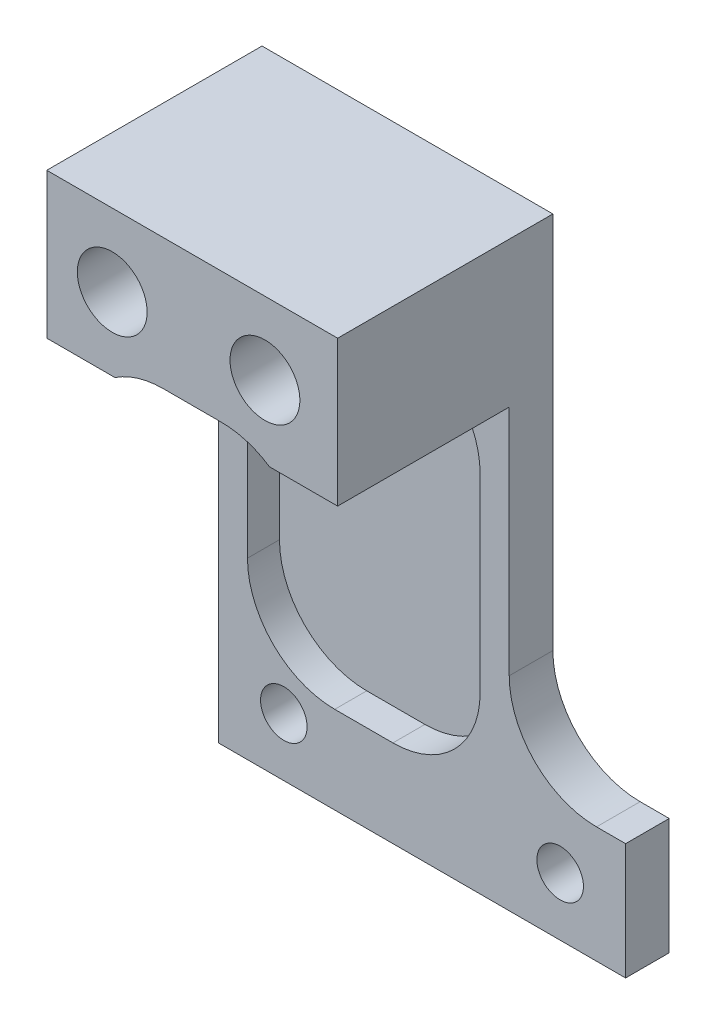
ISO-10303-21;
HEADER;
FILE_DESCRIPTION(('STEP AP214'),'2;1');
FILE_NAME('part.step','',(''),(''),'','','');
FILE_SCHEMA(('AUTOMOTIVE_DESIGN { 1 0 10303 214 1 1 1 1 }'));
ENDSEC;
DATA;
#1=APPLICATION_CONTEXT('core data for automotive mechanical design processes');
#2=APPLICATION_PROTOCOL_DEFINITION('international standard','automotive_design',2000,#1);
#3=PRODUCT_CONTEXT('',#1,'mechanical');
#4=PRODUCT('Part','Part','',(#3));
#5=PRODUCT_RELATED_PRODUCT_CATEGORY('part','',(#4));
#6=PRODUCT_DEFINITION_FORMATION('','',#4);
#7=PRODUCT_DEFINITION_CONTEXT('part definition',#1,'design');
#8=PRODUCT_DEFINITION('design','',#6,#7);
#9=PRODUCT_DEFINITION_SHAPE('','',#8);
#10=(LENGTH_UNIT() NAMED_UNIT(*) SI_UNIT(.MILLI.,.METRE.));
#11=(NAMED_UNIT(*) PLANE_ANGLE_UNIT() SI_UNIT($,.RADIAN.));
#12=(NAMED_UNIT(*) SI_UNIT($,.STERADIAN.) SOLID_ANGLE_UNIT());
#13=UNCERTAINTY_MEASURE_WITH_UNIT(LENGTH_MEASURE(1.E-05),#10,'distance_accuracy_value','');
#14=(GEOMETRIC_REPRESENTATION_CONTEXT(3) GLOBAL_UNCERTAINTY_ASSIGNED_CONTEXT((#13)) GLOBAL_UNIT_ASSIGNED_CONTEXT((#10,
#11,#12)) REPRESENTATION_CONTEXT('',''));
#15=CARTESIAN_POINT('',(0.,0.,0.));
#16=DIRECTION('',(0.,0.,1.));
#17=DIRECTION('',(1.,0.,0.));
#18=AXIS2_PLACEMENT_3D('',#15,#16,#17);
#19=CARTESIAN_POINT('',(7.,5.00000000000002,7.4));
#20=DIRECTION('',(0.,1.,0.));
#21=DIRECTION('',(-1.,0.,0.));
#22=AXIS2_PLACEMENT_3D('',#19,#20,#21);
#23=PLANE('',#22);
#24=DIRECTION('',(1.,0.,0.));
#25=VECTOR('',#24,1.);
#26=CARTESIAN_POINT('',(7.,5.00000000000002,1.5));
#27=LINE('',#26,#25);
#28=CARTESIAN_POINT('',(-7.,5.00000000000002,1.5));
#29=VERTEX_POINT('',#28);
#30=CARTESIAN_POINT('',(-4.6583123951777,5.00000000000002,1.5));
#31=VERTEX_POINT('',#30);
#32=EDGE_CURVE('E305',#29,#31,#27,.T.);
#33=ORIENTED_EDGE('',*,*,#32,.T.);
#34=DIRECTION('',(0.,0.,1.));
#35=VECTOR('',#34,1.);
#36=CARTESIAN_POINT('',(-4.6583123951777,5.00000000000002,0.4));
#37=LINE('',#36,#35);
#38=CARTESIAN_POINT('',(-4.6583123951777,5.00000000000002,7.4));
#39=VERTEX_POINT('',#38);
#40=EDGE_CURVE('E235',#31,#39,#37,.T.);
#41=ORIENTED_EDGE('',*,*,#40,.T.);
#42=DIRECTION('',(1.,0.,0.));
#43=VECTOR('',#42,1.);
#44=CARTESIAN_POINT('',(7.,5.00000000000002,7.4));
#45=LINE('',#44,#43);
#46=CARTESIAN_POINT('',(-7.,5.00000000000002,7.4));
#47=VERTEX_POINT('',#46);
#48=EDGE_CURVE('E308',#47,#39,#45,.T.);
#49=ORIENTED_EDGE('',*,*,#48,.F.);
#50=DIRECTION('',(0.,0.,-1.));
#51=VECTOR('',#50,1.);
#52=CARTESIAN_POINT('',(-7.,5.00000000000002,7.4));
#53=LINE('',#52,#51);
#54=EDGE_CURVE('E311',#47,#29,#53,.T.);
#55=ORIENTED_EDGE('',*,*,#54,.T.);
#56=EDGE_LOOP('',(#33,#41,#49,#55));
#57=FACE_BOUND('',#56,.T.);
#58=ADVANCED_FACE('F38',(#57),#23,.F.);
#59=CARTESIAN_POINT('',(-7.,0.,1.5));
#60=DIRECTION('',(-1.,0.,0.));
#61=DIRECTION('',(0.,-1.,0.));
#62=AXIS2_PLACEMENT_3D('',#59,#60,#61);
#63=PLANE('',#62);
#64=DIRECTION('',(0.,1.,0.));
#65=VECTOR('',#64,1.);
#66=CARTESIAN_POINT('',(-7.,0.,0.));
#67=LINE('',#66,#65);
#68=CARTESIAN_POINT('',(-7.,-9.99999999999999,0.));
#69=VERTEX_POINT('',#68);
#70=CARTESIAN_POINT('',(-7.,10.,0.));
#71=VERTEX_POINT('',#70);
#72=EDGE_CURVE('E316',#69,#71,#67,.T.);
#73=ORIENTED_EDGE('',*,*,#72,.F.);
#74=DIRECTION('',(0.,0.,-1.));
#75=VECTOR('',#74,1.);
#76=CARTESIAN_POINT('',(-7.,-9.99999999999999,1.5));
#77=LINE('',#76,#75);
#78=CARTESIAN_POINT('',(-7.,-9.99999999999999,1.5));
#79=VERTEX_POINT('',#78);
#80=EDGE_CURVE('E341',#79,#69,#77,.T.);
#81=ORIENTED_EDGE('',*,*,#80,.F.);
#82=DIRECTION('',(0.,1.,0.));
#83=VECTOR('',#82,1.);
#84=CARTESIAN_POINT('',(-7.,0.,1.5));
#85=LINE('',#84,#83);
#86=EDGE_CURVE('E317',#79,#29,#85,.T.);
#87=ORIENTED_EDGE('',*,*,#86,.T.);
#88=ORIENTED_EDGE('',*,*,#54,.F.);
#89=DIRECTION('',(0.,-1.,0.));
#90=VECTOR('',#89,1.);
#91=CARTESIAN_POINT('',(-7.,10.,7.4));
#92=LINE('',#91,#90);
#93=CARTESIAN_POINT('',(-7.,10.,7.4));
#94=VERTEX_POINT('',#93);
#95=EDGE_CURVE('E304',#94,#47,#92,.T.);
#96=ORIENTED_EDGE('',*,*,#95,.F.);
#97=DIRECTION('',(0.,0.,-1.));
#98=VECTOR('',#97,1.);
#99=CARTESIAN_POINT('',(-7.,10.,1.5));
#100=LINE('',#99,#98);
#101=EDGE_CURVE('E327',#94,#71,#100,.T.);
#102=ORIENTED_EDGE('',*,*,#101,.T.);
#103=EDGE_LOOP('',(#73,#81,#87,#88,#96,#102));
#104=FACE_BOUND('',#103,.T.);
#105=ADVANCED_FACE('F40',(#104),#63,.T.);
#106=CARTESIAN_POINT('',(0.,-9.99999999999999,1.5));
#107=DIRECTION('',(0.,-1.,0.));
#108=DIRECTION('',(1.,0.,0.));
#109=AXIS2_PLACEMENT_3D('',#106,#107,#108);
#110=PLANE('',#109);
#111=DIRECTION('',(-1.,0.,0.));
#112=VECTOR('',#111,1.);
#113=CARTESIAN_POINT('',(0.,-9.99999999999999,0.));
#114=LINE('',#113,#112);
#115=CARTESIAN_POINT('',(7.00000000000001,-9.99999999999998,0.));
#116=VERTEX_POINT('',#115);
#117=EDGE_CURVE('E330',#116,#69,#114,.T.);
#118=ORIENTED_EDGE('',*,*,#117,.F.);
#119=DIRECTION('',(0.,0.,-1.));
#120=VECTOR('',#119,1.);
#121=CARTESIAN_POINT('',(7.00000000000001,-9.99999999999998,1.5));
#122=LINE('',#121,#120);
#123=CARTESIAN_POINT('',(7.00000000000001,-9.99999999999998,1.5));
#124=VERTEX_POINT('',#123);
#125=EDGE_CURVE('E339',#124,#116,#122,.T.);
#126=ORIENTED_EDGE('',*,*,#125,.F.);
#127=DIRECTION('',(-1.,0.,0.));
#128=VECTOR('',#127,1.);
#129=CARTESIAN_POINT('',(0.,-9.99999999999999,1.5));
#130=LINE('',#129,#128);
#131=EDGE_CURVE('E320',#124,#79,#130,.T.);
#132=ORIENTED_EDGE('',*,*,#131,.T.);
#133=ORIENTED_EDGE('',*,*,#80,.T.);
#134=EDGE_LOOP('',(#118,#126,#132,#133));
#135=FACE_BOUND('',#134,.T.);
#136=ADVANCED_FACE('F422',(#135),#110,.T.);
#137=CARTESIAN_POINT('',(7.,0.,1.5));
#138=DIRECTION('',(-1.,0.,0.));
#139=DIRECTION('',(0.,-1.,0.));
#140=AXIS2_PLACEMENT_3D('',#137,#138,#139);
#141=PLANE('',#140);
#142=DIRECTION('',(0.,1.,0.));
#143=VECTOR('',#142,1.);
#144=CARTESIAN_POINT('',(7.,0.,0.));
#145=LINE('',#144,#143);
#146=CARTESIAN_POINT('',(7.,-5.99999999999998,0.));
#147=VERTEX_POINT('',#146);
#148=EDGE_CURVE('E333',#116,#147,#145,.T.);
#149=ORIENTED_EDGE('',*,*,#148,.T.);
#150=DIRECTION('',(0.,0.,1.));
#151=VECTOR('',#150,1.);
#152=CARTESIAN_POINT('',(7.,-5.99999999999998,0.));
#153=LINE('',#152,#151);
#154=CARTESIAN_POINT('',(7.,-5.99999999999998,1.5));
#155=VERTEX_POINT('',#154);
#156=EDGE_CURVE('E270',#147,#155,#153,.T.);
#157=ORIENTED_EDGE('',*,*,#156,.T.);
#158=DIRECTION('',(0.,1.,0.));
#159=VECTOR('',#158,1.);
#160=CARTESIAN_POINT('',(7.,0.,1.5));
#161=LINE('',#160,#159);
#162=EDGE_CURVE('E324',#124,#155,#161,.T.);
#163=ORIENTED_EDGE('',*,*,#162,.F.);
#164=ORIENTED_EDGE('',*,*,#125,.T.);
#165=EDGE_LOOP('',(#149,#157,#163,#164));
#166=FACE_BOUND('',#165,.T.);
#167=ADVANCED_FACE('F442',(#166),#141,.F.);
#168=CARTESIAN_POINT('',(0.,10.,1.5));
#169=DIRECTION('',(0.,-1.,0.));
#170=DIRECTION('',(1.,0.,0.));
#171=AXIS2_PLACEMENT_3D('',#168,#169,#170);
#172=PLANE('',#171);
#173=DIRECTION('',(-1.,0.,0.));
#174=VECTOR('',#173,1.);
#175=CARTESIAN_POINT('',(7.,10.,7.4));
#176=LINE('',#175,#174);
#177=CARTESIAN_POINT('',(3.,10.,7.4));
#178=VERTEX_POINT('',#177);
#179=EDGE_CURVE('E302',#178,#94,#176,.T.);
#180=ORIENTED_EDGE('',*,*,#179,.F.);
#181=DIRECTION('',(0.,0.,1.));
#182=VECTOR('',#181,1.);
#183=CARTESIAN_POINT('',(3.,10.,0.));
#184=LINE('',#183,#182);
#185=CARTESIAN_POINT('',(3.,10.,0.));
#186=VERTEX_POINT('',#185);
#187=EDGE_CURVE('E61',#186,#178,#184,.T.);
#188=ORIENTED_EDGE('',*,*,#187,.F.);
#189=DIRECTION('',(-1.,0.,0.));
#190=VECTOR('',#189,1.);
#191=CARTESIAN_POINT('',(0.,10.,0.));
#192=LINE('',#191,#190);
#193=EDGE_CURVE('E321',#186,#71,#192,.T.);
#194=ORIENTED_EDGE('',*,*,#193,.T.);
#195=ORIENTED_EDGE('',*,*,#101,.F.);
#196=EDGE_LOOP('',(#180,#188,#194,#195));
#197=FACE_BOUND('',#196,.T.);
#198=ADVANCED_FACE('F393',(#197),#172,.F.);
#199=CARTESIAN_POINT('',(0.,0.,1.5));
#200=DIRECTION('',(0.,0.,1.));
#201=DIRECTION('',(1.,0.,0.));
#202=AXIS2_PLACEMENT_3D('',#199,#200,#201);
#203=PLANE('',#202);
#204=CARTESIAN_POINT('',(-3.,2.50000000000002,1.5));
#205=DIRECTION('',(0.,0.,1.));
#206=DIRECTION('',(1.,0.,0.));
#207=AXIS2_PLACEMENT_3D('',#204,#205,#206);
#208=CIRCLE('',#207,3.);
#209=CARTESIAN_POINT('',(-6.,2.49999999999999,1.5));
#210=VERTEX_POINT('',#209);
#211=EDGE_CURVE('E176',#31,#210,#208,.T.);
#212=ORIENTED_EDGE('',*,*,#211,.F.);
#213=ORIENTED_EDGE('',*,*,#32,.F.);
#214=ORIENTED_EDGE('',*,*,#86,.F.);
#215=ORIENTED_EDGE('',*,*,#131,.F.);
#216=ORIENTED_EDGE('',*,*,#162,.T.);
#217=DIRECTION('',(1.,0.,0.));
#218=VECTOR('',#217,1.);
#219=CARTESIAN_POINT('',(0.,-5.99999999999998,1.5));
#220=LINE('',#219,#218);
#221=CARTESIAN_POINT('',(6.00000000000002,-5.99999999999998,1.5));
#222=VERTEX_POINT('',#221);
#223=EDGE_CURVE('E287',#222,#155,#220,.T.);
#224=ORIENTED_EDGE('',*,*,#223,.F.);
#225=CARTESIAN_POINT('',(6.,-2.99999999999998,1.5));
#226=DIRECTION('',(0.,0.,1.));
#227=DIRECTION('',(1.,0.,0.));
#228=AXIS2_PLACEMENT_3D('',#225,#226,#227);
#229=CIRCLE('',#228,3.);
#230=CARTESIAN_POINT('',(3.,-2.99999999999998,1.5));
#231=VERTEX_POINT('',#230);
#232=EDGE_CURVE('E285',#231,#222,#229,.T.);
#233=ORIENTED_EDGE('',*,*,#232,.F.);
#234=DIRECTION('',(0.,-1.,0.));
#235=VECTOR('',#234,1.);
#236=CARTESIAN_POINT('',(3.,0.,1.5));
#237=LINE('',#236,#235);
#238=CARTESIAN_POINT('',(3.,5.00000000000002,1.5));
#239=VERTEX_POINT('',#238);
#240=EDGE_CURVE('E283',#239,#231,#237,.T.);
#241=ORIENTED_EDGE('',*,*,#240,.F.);
#242=CARTESIAN_POINT('',(0.658312395177696,5.00000000000002,1.5));
#243=VERTEX_POINT('',#242);
#244=EDGE_CURVE('E301',#243,#239,#27,.T.);
#245=ORIENTED_EDGE('',*,*,#244,.F.);
#246=CARTESIAN_POINT('',(-1.,2.50000000000002,1.5));
#247=DIRECTION('',(0.,0.,1.));
#248=DIRECTION('',(1.,0.,0.));
#249=AXIS2_PLACEMENT_3D('',#246,#247,#248);
#250=CIRCLE('',#249,3.);
#251=CARTESIAN_POINT('',(2.,2.49999999999999,1.5));
#252=VERTEX_POINT('',#251);
#253=EDGE_CURVE('E233',#252,#243,#250,.T.);
#254=ORIENTED_EDGE('',*,*,#253,.F.);
#255=DIRECTION('',(0.,1.,0.));
#256=VECTOR('',#255,1.);
#257=CARTESIAN_POINT('',(2.,0.,1.5));
#258=LINE('',#257,#256);
#259=CARTESIAN_POINT('',(2.,-3.99999999999996,1.5));
#260=VERTEX_POINT('',#259);
#261=EDGE_CURVE('E11',#260,#252,#258,.T.);
#262=ORIENTED_EDGE('',*,*,#261,.F.);
#263=CARTESIAN_POINT('',(-1.,-3.99999999999998,1.5));
#264=DIRECTION('',(0.,0.,1.));
#265=DIRECTION('',(1.,0.,0.));
#266=AXIS2_PLACEMENT_3D('',#263,#264,#265);
#267=CIRCLE('',#266,3.);
#268=CARTESIAN_POINT('',(-1.00000000000002,-6.99999999999998,1.5));
#269=VERTEX_POINT('',#268);
#270=EDGE_CURVE('E46',#269,#260,#267,.T.);
#271=ORIENTED_EDGE('',*,*,#270,.F.);
#272=DIRECTION('',(1.,0.,0.));
#273=VECTOR('',#272,1.);
#274=CARTESIAN_POINT('',(0.,-6.99999999999998,1.5));
#275=LINE('',#274,#273);
#276=CARTESIAN_POINT('',(-2.99999999999998,-6.99999999999998,1.5));
#277=VERTEX_POINT('',#276);
#278=EDGE_CURVE('E353',#277,#269,#275,.T.);
#279=ORIENTED_EDGE('',*,*,#278,.F.);
#280=CARTESIAN_POINT('',(-3.,-3.99999999999998,1.5));
#281=DIRECTION('',(0.,0.,1.));
#282=DIRECTION('',(1.,0.,0.));
#283=AXIS2_PLACEMENT_3D('',#280,#281,#282);
#284=CIRCLE('',#283,3.);
#285=CARTESIAN_POINT('',(-6.,-3.99999999999996,1.5));
#286=VERTEX_POINT('',#285);
#287=EDGE_CURVE('E351',#286,#277,#284,.T.);
#288=ORIENTED_EDGE('',*,*,#287,.F.);
#289=DIRECTION('',(0.,-1.,0.));
#290=VECTOR('',#289,1.);
#291=CARTESIAN_POINT('',(-6.,0.,1.5));
#292=LINE('',#291,#290);
#293=EDGE_CURVE('E349',#210,#286,#292,.T.);
#294=ORIENTED_EDGE('',*,*,#293,.F.);
#295=EDGE_LOOP('',(#212,#213,#214,#215,#216,#224,#233,#241,#245,#254,#262,#271,#279,#288,#294));
#296=FACE_BOUND('',#295,.T.);
#297=CARTESIAN_POINT('',(-4.75,-7.99999999999999,1.5));
#298=DIRECTION('',(0.,0.,1.));
#299=DIRECTION('',(1.,0.,0.));
#300=AXIS2_PLACEMENT_3D('',#297,#298,#299);
#301=CIRCLE('',#300,0.799999999999994);
#302=CARTESIAN_POINT('',(-3.95,-7.99999999999999,1.5));
#303=VERTEX_POINT('',#302);
#304=EDGE_CURVE('E292',#303,#303,#301,.T.);
#305=ORIENTED_EDGE('',*,*,#304,.F.);
#306=EDGE_LOOP('',(#305));
#307=FACE_BOUND('',#306,.T.);
#308=CARTESIAN_POINT('',(4.75,-7.99999999999999,1.5));
#309=DIRECTION('',(0.,0.,1.));
#310=DIRECTION('',(1.,0.,0.));
#311=AXIS2_PLACEMENT_3D('',#308,#309,#310);
#312=CIRCLE('',#311,0.799999999999994);
#313=CARTESIAN_POINT('',(5.55,-7.99999999999999,1.5));
#314=VERTEX_POINT('',#313);
#315=EDGE_CURVE('E298',#314,#314,#312,.T.);
#316=ORIENTED_EDGE('',*,*,#315,.F.);
#317=EDGE_LOOP('',(#316));
#318=FACE_BOUND('',#317,.T.);
#319=ADVANCED_FACE('F365',(#296,#307,#318),#203,.T.);
#320=CARTESIAN_POINT('',(0.,0.,0.));
#321=DIRECTION('',(0.,0.,1.));
#322=DIRECTION('',(1.,0.,0.));
#323=AXIS2_PLACEMENT_3D('',#320,#321,#322);
#324=PLANE('',#323);
#325=CARTESIAN_POINT('',(-4.75,7.50000000000001,0.));
#326=DIRECTION('',(0.,0.,-1.));
#327=DIRECTION('',(-1.,0.,0.));
#328=AXIS2_PLACEMENT_3D('',#325,#326,#327);
#329=CIRCLE('',#328,2.2);
#330=CARTESIAN_POINT('',(-6.95,7.50000000000001,0.));
#331=VERTEX_POINT('',#330);
#332=EDGE_CURVE('E239',#331,#331,#329,.T.);
#333=ORIENTED_EDGE('',*,*,#332,.F.);
#334=EDGE_LOOP('',(#333));
#335=FACE_BOUND('',#334,.T.);
#336=CARTESIAN_POINT('',(0.499999999999997,7.50000000000001,0.));
#337=DIRECTION('',(0.,0.,-1.));
#338=DIRECTION('',(-1.,0.,0.));
#339=AXIS2_PLACEMENT_3D('',#336,#337,#338);
#340=CIRCLE('',#339,2.2);
#341=CARTESIAN_POINT('',(-1.7,7.50000000000001,0.));
#342=VERTEX_POINT('',#341);
#343=EDGE_CURVE('E249',#342,#342,#340,.T.);
#344=ORIENTED_EDGE('',*,*,#343,.F.);
#345=EDGE_LOOP('',(#344));
#346=FACE_BOUND('',#345,.T.);
#347=CARTESIAN_POINT('',(-4.75,-7.99999999999999,0.));
#348=DIRECTION('',(0.,0.,-1.));
#349=DIRECTION('',(-1.,0.,0.));
#350=AXIS2_PLACEMENT_3D('',#347,#348,#349);
#351=CIRCLE('',#350,0.79999999999999);
#352=CARTESIAN_POINT('',(-5.54999999999999,-7.99999999999999,0.));
#353=VERTEX_POINT('',#352);
#354=EDGE_CURVE('E289',#353,#353,#351,.T.);
#355=ORIENTED_EDGE('',*,*,#354,.F.);
#356=EDGE_LOOP('',(#355));
#357=FACE_BOUND('',#356,.T.);
#358=CARTESIAN_POINT('',(4.75,-7.99999999999999,0.));
#359=DIRECTION('',(0.,0.,-1.));
#360=DIRECTION('',(-1.,0.,0.));
#361=AXIS2_PLACEMENT_3D('',#358,#359,#360);
#362=CIRCLE('',#361,0.79999999999999);
#363=CARTESIAN_POINT('',(3.95000000000001,-7.99999999999999,0.));
#364=VERTEX_POINT('',#363);
#365=EDGE_CURVE('E295',#364,#364,#362,.T.);
#366=ORIENTED_EDGE('',*,*,#365,.F.);
#367=EDGE_LOOP('',(#366));
#368=FACE_BOUND('',#367,.T.);
#369=CARTESIAN_POINT('',(6.,-2.99999999999998,0.));
#370=DIRECTION('',(0.,0.,1.));
#371=DIRECTION('',(-1.,0.,0.));
#372=AXIS2_PLACEMENT_3D('',#369,#370,#371);
#373=CIRCLE('',#372,3.);
#374=CARTESIAN_POINT('',(3.,-2.99999999999998,0.));
#375=VERTEX_POINT('',#374);
#376=CARTESIAN_POINT('',(6.00000000000002,-5.99999999999998,0.));
#377=VERTEX_POINT('',#376);
#378=EDGE_CURVE('E262',#375,#377,#373,.T.);
#379=ORIENTED_EDGE('',*,*,#378,.T.);
#380=DIRECTION('',(1.,0.,0.));
#381=VECTOR('',#380,1.);
#382=CARTESIAN_POINT('',(7.,-5.99999999999998,0.));
#383=LINE('',#382,#381);
#384=EDGE_CURVE('E266',#377,#147,#383,.T.);
#385=ORIENTED_EDGE('',*,*,#384,.T.);
#386=ORIENTED_EDGE('',*,*,#148,.F.);
#387=ORIENTED_EDGE('',*,*,#117,.T.);
#388=ORIENTED_EDGE('',*,*,#72,.T.);
#389=ORIENTED_EDGE('',*,*,#193,.F.);
#390=DIRECTION('',(0.,-1.,0.));
#391=VECTOR('',#390,1.);
#392=CARTESIAN_POINT('',(3.,-2.99999999999996,0.));
#393=LINE('',#392,#391);
#394=EDGE_CURVE('E259',#186,#375,#393,.T.);
#395=ORIENTED_EDGE('',*,*,#394,.T.);
#396=EDGE_LOOP('',(#379,#385,#386,#387,#388,#389,#395));
#397=FACE_BOUND('',#396,.T.);
#398=ADVANCED_FACE('F390',(#335,#346,#357,#368,#397),#324,.F.);
#399=CARTESIAN_POINT('',(0.658312395177697,5.00000000000002,7.4));
#400=VERTEX_POINT('',#399);
#401=CARTESIAN_POINT('',(3.,5.00000000000002,7.4));
#402=VERTEX_POINT('',#401);
#403=EDGE_CURVE('E307',#400,#402,#45,.T.);
#404=ORIENTED_EDGE('',*,*,#403,.F.);
#405=DIRECTION('',(0.,0.,1.));
#406=VECTOR('',#405,1.);
#407=CARTESIAN_POINT('',(0.658312395177696,5.00000000000002,0.4));
#408=LINE('',#407,#406);
#409=EDGE_CURVE('E53',#400,#243,#408,.F.);
#410=ORIENTED_EDGE('',*,*,#409,.T.);
#411=ORIENTED_EDGE('',*,*,#244,.T.);
#412=DIRECTION('',(0.,0.,1.));
#413=VECTOR('',#412,1.);
#414=CARTESIAN_POINT('',(3.,5.00000000000002,7.4));
#415=LINE('',#414,#413);
#416=EDGE_CURVE('E273',#239,#402,#415,.T.);
#417=ORIENTED_EDGE('',*,*,#416,.T.);
#418=EDGE_LOOP('',(#404,#410,#411,#417));
#419=FACE_BOUND('',#418,.T.);
#420=ADVANCED_FACE('F373',(#419),#23,.F.);
#421=CARTESIAN_POINT('',(0.,0.,7.4));
#422=DIRECTION('',(0.,0.,-1.));
#423=DIRECTION('',(-1.,0.,0.));
#424=AXIS2_PLACEMENT_3D('',#421,#422,#423);
#425=PLANE('',#424);
#426=CARTESIAN_POINT('',(-4.75,7.50000000000001,7.4));
#427=DIRECTION('',(0.,0.,-1.));
#428=DIRECTION('',(-1.,0.,0.));
#429=AXIS2_PLACEMENT_3D('',#426,#427,#428);
#430=CIRCLE('',#429,1.2);
#431=CARTESIAN_POINT('',(-5.95,7.50000000000001,7.4));
#432=VERTEX_POINT('',#431);
#433=EDGE_CURVE('E248',#432,#432,#430,.T.);
#434=ORIENTED_EDGE('',*,*,#433,.T.);
#435=EDGE_LOOP('',(#434));
#436=FACE_BOUND('',#435,.T.);
#437=CARTESIAN_POINT('',(0.499999999999997,7.50000000000001,7.4));
#438=DIRECTION('',(0.,0.,-1.));
#439=DIRECTION('',(-1.,0.,0.));
#440=AXIS2_PLACEMENT_3D('',#437,#438,#439);
#441=CIRCLE('',#440,1.2);
#442=CARTESIAN_POINT('',(-0.700000000000001,7.50000000000001,7.4));
#443=VERTEX_POINT('',#442);
#444=EDGE_CURVE('E258',#443,#443,#441,.T.);
#445=ORIENTED_EDGE('',*,*,#444,.T.);
#446=EDGE_LOOP('',(#445));
#447=FACE_BOUND('',#446,.T.);
#448=ORIENTED_EDGE('',*,*,#48,.T.);
#449=CARTESIAN_POINT('',(-3.,2.50000000000002,7.4));
#450=DIRECTION('',(0.,0.,1.));
#451=DIRECTION('',(1.,0.,0.));
#452=AXIS2_PLACEMENT_3D('',#449,#450,#451);
#453=CIRCLE('',#452,3.);
#454=CARTESIAN_POINT('',(-2.99999999999998,5.50000000000002,7.4));
#455=VERTEX_POINT('',#454);
#456=EDGE_CURVE('E197',#455,#39,#453,.T.);
#457=ORIENTED_EDGE('',*,*,#456,.F.);
#458=DIRECTION('',(-1.,0.,0.));
#459=VECTOR('',#458,1.);
#460=CARTESIAN_POINT('',(-2.99999999999998,5.50000000000002,7.4));
#461=LINE('',#460,#459);
#462=CARTESIAN_POINT('',(-1.00000000000002,5.50000000000002,7.4));
#463=VERTEX_POINT('',#462);
#464=EDGE_CURVE('E194',#463,#455,#461,.T.);
#465=ORIENTED_EDGE('',*,*,#464,.F.);
#466=CARTESIAN_POINT('',(-1.,2.50000000000002,7.4));
#467=DIRECTION('',(0.,0.,-1.));
#468=DIRECTION('',(-1.,0.,0.));
#469=AXIS2_PLACEMENT_3D('',#466,#467,#468);
#470=CIRCLE('',#469,3.);
#471=EDGE_CURVE('E343',#463,#400,#470,.T.);
#472=ORIENTED_EDGE('',*,*,#471,.T.);
#473=ORIENTED_EDGE('',*,*,#403,.T.);
#474=DIRECTION('',(0.,-1.,0.));
#475=VECTOR('',#474,1.);
#476=CARTESIAN_POINT('',(3.,-2.99999999999996,7.4));
#477=LINE('',#476,#475);
#478=EDGE_CURVE('E263',#178,#402,#477,.T.);
#479=ORIENTED_EDGE('',*,*,#478,.F.);
#480=ORIENTED_EDGE('',*,*,#179,.T.);
#481=ORIENTED_EDGE('',*,*,#95,.T.);
#482=EDGE_LOOP('',(#448,#457,#465,#472,#473,#479,#480,#481));
#483=FACE_BOUND('',#482,.T.);
#484=ADVANCED_FACE('F376',(#436,#447,#483),#425,.F.);
#485=CARTESIAN_POINT('',(4.75,-7.99999999999999,0.));
#486=DIRECTION('',(0.,0.,-1.));
#487=DIRECTION('',(-1.,0.,0.));
#488=AXIS2_PLACEMENT_3D('',#485,#486,#487);
#489=CYLINDRICAL_SURFACE('',#488,0.799999999999994);
#490=ORIENTED_EDGE('',*,*,#315,.T.);
#491=EDGE_LOOP('',(#490));
#492=FACE_BOUND('',#491,.T.);
#493=ORIENTED_EDGE('',*,*,#365,.T.);
#494=EDGE_LOOP('',(#493));
#495=FACE_BOUND('',#494,.T.);
#496=ADVANCED_FACE('F430',(#492,#495),#489,.F.);
#497=CARTESIAN_POINT('',(-4.75,-7.99999999999999,0.));
#498=DIRECTION('',(0.,0.,-1.));
#499=DIRECTION('',(-1.,0.,0.));
#500=AXIS2_PLACEMENT_3D('',#497,#498,#499);
#501=CYLINDRICAL_SURFACE('',#500,0.799999999999994);
#502=ORIENTED_EDGE('',*,*,#304,.T.);
#503=EDGE_LOOP('',(#502));
#504=FACE_BOUND('',#503,.T.);
#505=ORIENTED_EDGE('',*,*,#354,.T.);
#506=EDGE_LOOP('',(#505));
#507=FACE_BOUND('',#506,.T.);
#508=ADVANCED_FACE('F582',(#504,#507),#501,.F.);
#509=CARTESIAN_POINT('',(7.,-5.99999999999998,0.));
#510=DIRECTION('',(0.,-1.,0.));
#511=DIRECTION('',(0.,0.,-1.));
#512=AXIS2_PLACEMENT_3D('',#509,#510,#511);
#513=PLANE('',#512);
#514=ORIENTED_EDGE('',*,*,#223,.T.);
#515=ORIENTED_EDGE('',*,*,#156,.F.);
#516=ORIENTED_EDGE('',*,*,#384,.F.);
#517=DIRECTION('',(0.,0.,1.));
#518=VECTOR('',#517,1.);
#519=CARTESIAN_POINT('',(6.00000000000002,-5.99999999999998,0.));
#520=LINE('',#519,#518);
#521=EDGE_CURVE('E274',#377,#222,#520,.T.);
#522=ORIENTED_EDGE('',*,*,#521,.T.);
#523=EDGE_LOOP('',(#514,#515,#516,#522));
#524=FACE_BOUND('',#523,.T.);
#525=ADVANCED_FACE('F387',(#524),#513,.F.);
#526=CARTESIAN_POINT('',(6.,-2.99999999999998,0.));
#527=DIRECTION('',(0.,0.,1.));
#528=DIRECTION('',(1.,0.,0.));
#529=AXIS2_PLACEMENT_3D('',#526,#527,#528);
#530=CYLINDRICAL_SURFACE('',#529,3.);
#531=ORIENTED_EDGE('',*,*,#232,.T.);
#532=ORIENTED_EDGE('',*,*,#521,.F.);
#533=ORIENTED_EDGE('',*,*,#378,.F.);
#534=DIRECTION('',(0.,0.,1.));
#535=VECTOR('',#534,1.);
#536=CARTESIAN_POINT('',(3.,-2.99999999999998,0.));
#537=LINE('',#536,#535);
#538=EDGE_CURVE('E277',#375,#231,#537,.T.);
#539=ORIENTED_EDGE('',*,*,#538,.T.);
#540=EDGE_LOOP('',(#531,#532,#533,#539));
#541=FACE_BOUND('',#540,.T.);
#542=ADVANCED_FACE('F383',(#541),#530,.F.);
#543=CARTESIAN_POINT('',(3.,-2.99999999999996,0.));
#544=DIRECTION('',(-1.,0.,0.));
#545=DIRECTION('',(0.,0.,1.));
#546=AXIS2_PLACEMENT_3D('',#543,#544,#545);
#547=PLANE('',#546);
#548=ORIENTED_EDGE('',*,*,#240,.T.);
#549=ORIENTED_EDGE('',*,*,#538,.F.);
#550=ORIENTED_EDGE('',*,*,#394,.F.);
#551=ORIENTED_EDGE('',*,*,#187,.T.);
#552=ORIENTED_EDGE('',*,*,#478,.T.);
#553=ORIENTED_EDGE('',*,*,#416,.F.);
#554=EDGE_LOOP('',(#548,#549,#550,#551,#552,#553));
#555=FACE_BOUND('',#554,.T.);
#556=ADVANCED_FACE('F379',(#555),#547,.F.);
#557=CARTESIAN_POINT('',(0.499999999999997,7.50000000000001,0.));
#558=DIRECTION('',(0.,0.,-1.));
#559=DIRECTION('',(-1.,0.,0.));
#560=AXIS2_PLACEMENT_3D('',#557,#558,#559);
#561=CYLINDRICAL_SURFACE('',#560,1.2);
#562=CARTESIAN_POINT('',(0.499999999999997,7.50000000000001,2.4));
#563=DIRECTION('',(0.,0.,-1.));
#564=DIRECTION('',(-1.,0.,0.));
#565=AXIS2_PLACEMENT_3D('',#562,#563,#564);
#566=CIRCLE('',#565,1.2);
#567=CARTESIAN_POINT('',(-0.700000000000001,7.50000000000001,2.4));
#568=VERTEX_POINT('',#567);
#569=EDGE_CURVE('E255',#568,#568,#566,.T.);
#570=ORIENTED_EDGE('',*,*,#569,.T.);
#571=EDGE_LOOP('',(#570));
#572=FACE_BOUND('',#571,.T.);
#573=ORIENTED_EDGE('',*,*,#444,.F.);
#574=EDGE_LOOP('',(#573));
#575=FACE_BOUND('',#574,.T.);
#576=ADVANCED_FACE('F575',(#572,#575),#561,.F.);
#577=CARTESIAN_POINT('',(1.7,7.50000000000001,2.4));
#578=DIRECTION('',(0.,0.,1.));
#579=DIRECTION('',(1.,0.,0.));
#580=AXIS2_PLACEMENT_3D('',#577,#578,#579);
#581=PLANE('',#580);
#582=ORIENTED_EDGE('',*,*,#569,.F.);
#583=EDGE_LOOP('',(#582));
#584=FACE_BOUND('',#583,.T.);
#585=CARTESIAN_POINT('',(0.499999999999997,7.50000000000001,2.4));
#586=DIRECTION('',(0.,0.,-1.));
#587=DIRECTION('',(-1.,0.,0.));
#588=AXIS2_PLACEMENT_3D('',#585,#586,#587);
#589=CIRCLE('',#588,2.2);
#590=CARTESIAN_POINT('',(-1.7,7.50000000000001,2.4));
#591=VERTEX_POINT('',#590);
#592=EDGE_CURVE('E252',#591,#591,#589,.T.);
#593=ORIENTED_EDGE('',*,*,#592,.T.);
#594=EDGE_LOOP('',(#593));
#595=FACE_BOUND('',#594,.T.);
#596=ADVANCED_FACE('F571',(#584,#595),#581,.F.);
#597=CARTESIAN_POINT('',(0.499999999999997,7.50000000000001,0.));
#598=DIRECTION('',(0.,0.,-1.));
#599=DIRECTION('',(-1.,0.,0.));
#600=AXIS2_PLACEMENT_3D('',#597,#598,#599);
#601=CYLINDRICAL_SURFACE('',#600,2.2);
#602=ORIENTED_EDGE('',*,*,#592,.F.);
#603=EDGE_LOOP('',(#602));
#604=FACE_BOUND('',#603,.T.);
#605=ORIENTED_EDGE('',*,*,#343,.T.);
#606=EDGE_LOOP('',(#605));
#607=FACE_BOUND('',#606,.T.);
#608=ADVANCED_FACE('F567',(#604,#607),#601,.F.);
#609=CARTESIAN_POINT('',(-4.75,7.50000000000001,0.));
#610=DIRECTION('',(0.,0.,-1.));
#611=DIRECTION('',(-1.,0.,0.));
#612=AXIS2_PLACEMENT_3D('',#609,#610,#611);
#613=CYLINDRICAL_SURFACE('',#612,1.2);
#614=CARTESIAN_POINT('',(-4.75,7.50000000000001,2.4));
#615=DIRECTION('',(0.,0.,-1.));
#616=DIRECTION('',(-1.,0.,0.));
#617=AXIS2_PLACEMENT_3D('',#614,#615,#616);
#618=CIRCLE('',#617,1.2);
#619=CARTESIAN_POINT('',(-5.95,7.50000000000001,2.4));
#620=VERTEX_POINT('',#619);
#621=EDGE_CURVE('E245',#620,#620,#618,.T.);
#622=ORIENTED_EDGE('',*,*,#621,.T.);
#623=EDGE_LOOP('',(#622));
#624=FACE_BOUND('',#623,.T.);
#625=ORIENTED_EDGE('',*,*,#433,.F.);
#626=EDGE_LOOP('',(#625));
#627=FACE_BOUND('',#626,.T.);
#628=ADVANCED_FACE('F563',(#624,#627),#613,.F.);
#629=CARTESIAN_POINT('',(-3.55,7.50000000000001,2.4));
#630=DIRECTION('',(0.,0.,1.));
#631=DIRECTION('',(1.,0.,0.));
#632=AXIS2_PLACEMENT_3D('',#629,#630,#631);
#633=PLANE('',#632);
#634=ORIENTED_EDGE('',*,*,#621,.F.);
#635=EDGE_LOOP('',(#634));
#636=FACE_BOUND('',#635,.T.);
#637=CARTESIAN_POINT('',(-4.75,7.50000000000001,2.4));
#638=DIRECTION('',(0.,0.,-1.));
#639=DIRECTION('',(-1.,0.,0.));
#640=AXIS2_PLACEMENT_3D('',#637,#638,#639);
#641=CIRCLE('',#640,2.2);
#642=CARTESIAN_POINT('',(-6.95,7.50000000000001,2.4));
#643=VERTEX_POINT('',#642);
#644=EDGE_CURVE('E242',#643,#643,#641,.T.);
#645=ORIENTED_EDGE('',*,*,#644,.T.);
#646=EDGE_LOOP('',(#645));
#647=FACE_BOUND('',#646,.T.);
#648=ADVANCED_FACE('F559',(#636,#647),#633,.F.);
#649=CARTESIAN_POINT('',(-4.75,7.50000000000001,0.));
#650=DIRECTION('',(0.,0.,-1.));
#651=DIRECTION('',(-1.,0.,0.));
#652=AXIS2_PLACEMENT_3D('',#649,#650,#651);
#653=CYLINDRICAL_SURFACE('',#652,2.2);
#654=ORIENTED_EDGE('',*,*,#644,.F.);
#655=EDGE_LOOP('',(#654));
#656=FACE_BOUND('',#655,.T.);
#657=ORIENTED_EDGE('',*,*,#332,.T.);
#658=EDGE_LOOP('',(#657));
#659=FACE_BOUND('',#658,.T.);
#660=ADVANCED_FACE('F495',(#656,#659),#653,.F.);
#661=CARTESIAN_POINT('',(-3.,2.50000000000002,0.4));
#662=DIRECTION('',(0.,0.,1.));
#663=DIRECTION('',(1.,0.,0.));
#664=AXIS2_PLACEMENT_3D('',#661,#662,#663);
#665=CYLINDRICAL_SURFACE('',#664,3.);
#666=ORIENTED_EDGE('',*,*,#211,.T.);
#667=DIRECTION('',(0.,0.,1.));
#668=VECTOR('',#667,1.);
#669=CARTESIAN_POINT('',(-6.,2.49999999999999,0.4));
#670=LINE('',#669,#668);
#671=CARTESIAN_POINT('',(-6.,2.49999999999999,0.4));
#672=VERTEX_POINT('',#671);
#673=EDGE_CURVE('E169',#672,#210,#670,.T.);
#674=ORIENTED_EDGE('',*,*,#673,.F.);
#675=CARTESIAN_POINT('',(-3.,2.50000000000002,0.4));
#676=DIRECTION('',(0.,0.,1.));
#677=DIRECTION('',(1.,0.,0.));
#678=AXIS2_PLACEMENT_3D('',#675,#676,#677);
#679=CIRCLE('',#678,3.);
#680=CARTESIAN_POINT('',(-2.99999999999998,5.50000000000002,0.4));
#681=VERTEX_POINT('',#680);
#682=EDGE_CURVE('E173',#681,#672,#679,.T.);
#683=ORIENTED_EDGE('',*,*,#682,.F.);
#684=DIRECTION('',(0.,0.,1.));
#685=VECTOR('',#684,1.);
#686=CARTESIAN_POINT('',(-2.99999999999998,5.50000000000002,0.4));
#687=LINE('',#686,#685);
#688=EDGE_CURVE('E214',#681,#455,#687,.T.);
#689=ORIENTED_EDGE('',*,*,#688,.T.);
#690=ORIENTED_EDGE('',*,*,#456,.T.);
#691=ORIENTED_EDGE('',*,*,#40,.F.);
#692=EDGE_LOOP('',(#666,#674,#683,#689,#690,#691));
#693=FACE_BOUND('',#692,.T.);
#694=ADVANCED_FACE('F171',(#693),#665,.F.);
#695=CARTESIAN_POINT('',(-2.99999999999998,5.50000000000002,0.4));
#696=DIRECTION('',(0.,1.,0.));
#697=DIRECTION('',(0.,0.,1.));
#698=AXIS2_PLACEMENT_3D('',#695,#696,#697);
#699=PLANE('',#698);
#700=ORIENTED_EDGE('',*,*,#464,.T.);
#701=ORIENTED_EDGE('',*,*,#688,.F.);
#702=DIRECTION('',(-1.,0.,0.));
#703=VECTOR('',#702,1.);
#704=CARTESIAN_POINT('',(-2.99999999999998,5.50000000000002,0.4));
#705=LINE('',#704,#703);
#706=CARTESIAN_POINT('',(-1.00000000000002,5.50000000000002,0.4));
#707=VERTEX_POINT('',#706);
#708=EDGE_CURVE('E180',#707,#681,#705,.T.);
#709=ORIENTED_EDGE('',*,*,#708,.F.);
#710=DIRECTION('',(0.,0.,1.));
#711=VECTOR('',#710,1.);
#712=CARTESIAN_POINT('',(-1.00000000000002,5.50000000000002,0.4));
#713=LINE('',#712,#711);
#714=EDGE_CURVE('E216',#707,#463,#713,.T.);
#715=ORIENTED_EDGE('',*,*,#714,.T.);
#716=EDGE_LOOP('',(#700,#701,#709,#715));
#717=FACE_BOUND('',#716,.T.);
#718=ADVANCED_FACE('F494',(#717),#699,.F.);
#719=CARTESIAN_POINT('',(-1.,2.50000000000002,0.4));
#720=DIRECTION('',(0.,0.,1.));
#721=DIRECTION('',(1.,0.,0.));
#722=AXIS2_PLACEMENT_3D('',#719,#720,#721);
#723=CYLINDRICAL_SURFACE('',#722,3.);
#724=ORIENTED_EDGE('',*,*,#253,.T.);
#725=ORIENTED_EDGE('',*,*,#409,.F.);
#726=ORIENTED_EDGE('',*,*,#471,.F.);
#727=ORIENTED_EDGE('',*,*,#714,.F.);
#728=CARTESIAN_POINT('',(-1.,2.50000000000002,0.4));
#729=DIRECTION('',(0.,0.,1.));
#730=DIRECTION('',(-1.,0.,0.));
#731=AXIS2_PLACEMENT_3D('',#728,#729,#730);
#732=CIRCLE('',#731,3.);
#733=CARTESIAN_POINT('',(2.,2.49999999999999,0.4));
#734=VERTEX_POINT('',#733);
#735=EDGE_CURVE('E210',#734,#707,#732,.T.);
#736=ORIENTED_EDGE('',*,*,#735,.F.);
#737=DIRECTION('',(0.,0.,1.));
#738=VECTOR('',#737,1.);
#739=CARTESIAN_POINT('',(2.,2.49999999999999,0.4));
#740=LINE('',#739,#738);
#741=EDGE_CURVE('E219',#734,#252,#740,.T.);
#742=ORIENTED_EDGE('',*,*,#741,.T.);
#743=EDGE_LOOP('',(#724,#725,#726,#727,#736,#742));
#744=FACE_BOUND('',#743,.T.);
#745=ADVANCED_FACE('F369',(#744),#723,.F.);
#746=CARTESIAN_POINT('',(2.,2.49999999999999,0.4));
#747=DIRECTION('',(1.,0.,0.));
#748=DIRECTION('',(0.,0.,-1.));
#749=AXIS2_PLACEMENT_3D('',#746,#747,#748);
#750=PLANE('',#749);
#751=ORIENTED_EDGE('',*,*,#261,.T.);
#752=ORIENTED_EDGE('',*,*,#741,.F.);
#753=DIRECTION('',(0.,1.,0.));
#754=VECTOR('',#753,1.);
#755=CARTESIAN_POINT('',(2.,2.49999999999999,0.4));
#756=LINE('',#755,#754);
#757=CARTESIAN_POINT('',(2.,-3.99999999999996,0.4));
#758=VERTEX_POINT('',#757);
#759=EDGE_CURVE('E207',#758,#734,#756,.T.);
#760=ORIENTED_EDGE('',*,*,#759,.F.);
#761=DIRECTION('',(0.,0.,1.));
#762=VECTOR('',#761,1.);
#763=CARTESIAN_POINT('',(2.,-3.99999999999996,0.4));
#764=LINE('',#763,#762);
#765=EDGE_CURVE('E222',#758,#260,#764,.T.);
#766=ORIENTED_EDGE('',*,*,#765,.T.);
#767=EDGE_LOOP('',(#751,#752,#760,#766));
#768=FACE_BOUND('',#767,.T.);
#769=ADVANCED_FACE('F363',(#768),#750,.F.);
#770=CARTESIAN_POINT('',(-1.,-3.99999999999998,0.4));
#771=DIRECTION('',(0.,0.,1.));
#772=DIRECTION('',(1.,0.,0.));
#773=AXIS2_PLACEMENT_3D('',#770,#771,#772);
#774=CYLINDRICAL_SURFACE('',#773,3.);
#775=ORIENTED_EDGE('',*,*,#270,.T.);
#776=ORIENTED_EDGE('',*,*,#765,.F.);
#777=CARTESIAN_POINT('',(-1.,-3.99999999999998,0.4));
#778=DIRECTION('',(0.,0.,1.));
#779=DIRECTION('',(1.,0.,0.));
#780=AXIS2_PLACEMENT_3D('',#777,#778,#779);
#781=CIRCLE('',#780,3.);
#782=CARTESIAN_POINT('',(-1.00000000000002,-6.99999999999998,0.4));
#783=VERTEX_POINT('',#782);
#784=EDGE_CURVE('E204',#783,#758,#781,.T.);
#785=ORIENTED_EDGE('',*,*,#784,.F.);
#786=DIRECTION('',(0.,0.,1.));
#787=VECTOR('',#786,1.);
#788=CARTESIAN_POINT('',(-1.00000000000002,-6.99999999999998,0.4));
#789=LINE('',#788,#787);
#790=EDGE_CURVE('E225',#783,#269,#789,.T.);
#791=ORIENTED_EDGE('',*,*,#790,.T.);
#792=EDGE_LOOP('',(#775,#776,#785,#791));
#793=FACE_BOUND('',#792,.T.);
#794=ADVANCED_FACE('F356',(#793),#774,.F.);
#795=CARTESIAN_POINT('',(-2.99999999999998,-6.99999999999998,0.4));
#796=DIRECTION('',(0.,-1.,0.));
#797=DIRECTION('',(0.,0.,-1.));
#798=AXIS2_PLACEMENT_3D('',#795,#796,#797);
#799=PLANE('',#798);
#800=ORIENTED_EDGE('',*,*,#278,.T.);
#801=ORIENTED_EDGE('',*,*,#790,.F.);
#802=DIRECTION('',(1.,0.,0.));
#803=VECTOR('',#802,1.);
#804=CARTESIAN_POINT('',(-2.99999999999998,-6.99999999999998,0.4));
#805=LINE('',#804,#803);
#806=CARTESIAN_POINT('',(-2.99999999999998,-6.99999999999998,0.4));
#807=VERTEX_POINT('',#806);
#808=EDGE_CURVE('E201',#807,#783,#805,.T.);
#809=ORIENTED_EDGE('',*,*,#808,.F.);
#810=DIRECTION('',(0.,0.,1.));
#811=VECTOR('',#810,1.);
#812=CARTESIAN_POINT('',(-2.99999999999998,-6.99999999999998,0.4));
#813=LINE('',#812,#811);
#814=EDGE_CURVE('E228',#807,#277,#813,.T.);
#815=ORIENTED_EDGE('',*,*,#814,.T.);
#816=EDGE_LOOP('',(#800,#801,#809,#815));
#817=FACE_BOUND('',#816,.T.);
#818=ADVANCED_FACE('F408',(#817),#799,.F.);
#819=CARTESIAN_POINT('',(-3.,-3.99999999999998,0.4));
#820=DIRECTION('',(0.,0.,1.));
#821=DIRECTION('',(1.,0.,0.));
#822=AXIS2_PLACEMENT_3D('',#819,#820,#821);
#823=CYLINDRICAL_SURFACE('',#822,3.);
#824=ORIENTED_EDGE('',*,*,#287,.T.);
#825=ORIENTED_EDGE('',*,*,#814,.F.);
#826=CARTESIAN_POINT('',(-3.,-3.99999999999998,0.4));
#827=DIRECTION('',(0.,0.,1.));
#828=DIRECTION('',(1.,0.,0.));
#829=AXIS2_PLACEMENT_3D('',#826,#827,#828);
#830=CIRCLE('',#829,3.);
#831=CARTESIAN_POINT('',(-6.,-3.99999999999996,0.4));
#832=VERTEX_POINT('',#831);
#833=EDGE_CURVE('E189',#832,#807,#830,.T.);
#834=ORIENTED_EDGE('',*,*,#833,.F.);
#835=DIRECTION('',(0.,0.,1.));
#836=VECTOR('',#835,1.);
#837=CARTESIAN_POINT('',(-6.,-3.99999999999996,0.4));
#838=LINE('',#837,#836);
#839=EDGE_CURVE('E179',#832,#286,#838,.T.);
#840=ORIENTED_EDGE('',*,*,#839,.T.);
#841=EDGE_LOOP('',(#824,#825,#834,#840));
#842=FACE_BOUND('',#841,.T.);
#843=ADVANCED_FACE('F405',(#842),#823,.F.);
#844=CARTESIAN_POINT('',(-6.,2.49999999999999,0.4));
#845=DIRECTION('',(-1.,0.,0.));
#846=DIRECTION('',(0.,-1.,0.));
#847=AXIS2_PLACEMENT_3D('',#844,#845,#846);
#848=PLANE('',#847);
#849=ORIENTED_EDGE('',*,*,#293,.T.);
#850=ORIENTED_EDGE('',*,*,#839,.F.);
#851=DIRECTION('',(0.,-1.,0.));
#852=VECTOR('',#851,1.);
#853=CARTESIAN_POINT('',(-6.,2.49999999999999,0.4));
#854=LINE('',#853,#852);
#855=EDGE_CURVE('E183',#672,#832,#854,.T.);
#856=ORIENTED_EDGE('',*,*,#855,.F.);
#857=ORIENTED_EDGE('',*,*,#673,.T.);
#858=EDGE_LOOP('',(#849,#850,#856,#857));
#859=FACE_BOUND('',#858,.T.);
#860=ADVANCED_FACE('F184',(#859),#848,.F.);
#861=CARTESIAN_POINT('',(-3.,2.50000000000002,0.4));
#862=DIRECTION('',(0.,0.,1.));
#863=DIRECTION('',(1.,0.,0.));
#864=AXIS2_PLACEMENT_3D('',#861,#862,#863);
#865=PLANE('',#864);
#866=ORIENTED_EDGE('',*,*,#682,.T.);
#867=ORIENTED_EDGE('',*,*,#855,.T.);
#868=ORIENTED_EDGE('',*,*,#833,.T.);
#869=ORIENTED_EDGE('',*,*,#808,.T.);
#870=ORIENTED_EDGE('',*,*,#784,.T.);
#871=ORIENTED_EDGE('',*,*,#759,.T.);
#872=ORIENTED_EDGE('',*,*,#735,.T.);
#873=ORIENTED_EDGE('',*,*,#708,.T.);
#874=EDGE_LOOP('',(#866,#867,#868,#869,#870,#871,#872,#873));
#875=FACE_BOUND('',#874,.T.);
#876=ADVANCED_FACE('F191',(#875),#865,.T.);
#877=CLOSED_SHELL('',(#58,#105,#136,#167,#198,#319,#398,#420,#484,#496,#508,#525,#542,#556,#576,
#596,#608,#628,#648,#660,#694,#718,#745,#769,#794,#818,#843,#860,#876));
#878=MANIFOLD_SOLID_BREP('B2',#877);
#879=ADVANCED_BREP_SHAPE_REPRESENTATION('',(#18,#878),#14);
#880=SHAPE_DEFINITION_REPRESENTATION(#9,#879);
ENDSEC;
END-ISO-10303-21;
